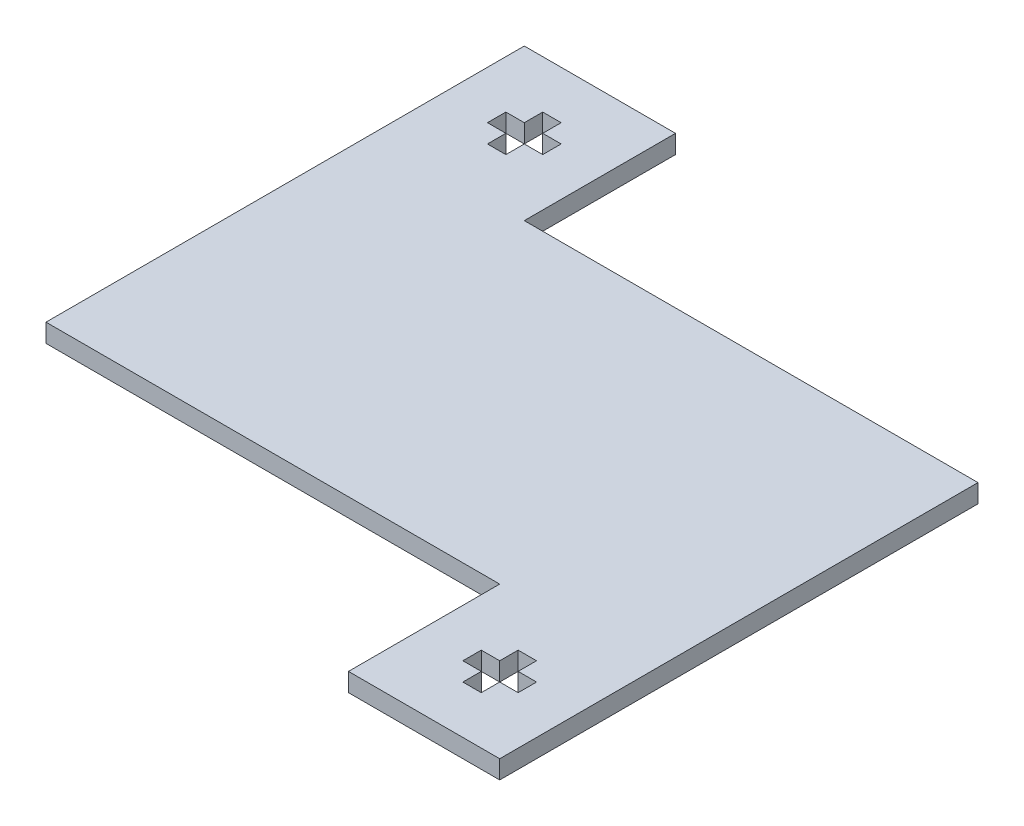
ISO-10303-21;
HEADER;
FILE_DESCRIPTION(('STEP AP214'),'2;1');
FILE_NAME('part.step','',(''),(''),'','','');
FILE_SCHEMA(('AUTOMOTIVE_DESIGN { 1 0 10303 214 1 1 1 1 }'));
ENDSEC;
DATA;
#1=APPLICATION_CONTEXT('core data for automotive mechanical design processes');
#2=APPLICATION_PROTOCOL_DEFINITION('international standard','automotive_design',2000,#1);
#3=PRODUCT_CONTEXT('',#1,'mechanical');
#4=PRODUCT('Part','Part','',(#3));
#5=PRODUCT_RELATED_PRODUCT_CATEGORY('part','',(#4));
#6=PRODUCT_DEFINITION_FORMATION('','',#4);
#7=PRODUCT_DEFINITION_CONTEXT('part definition',#1,'design');
#8=PRODUCT_DEFINITION('design','',#6,#7);
#9=PRODUCT_DEFINITION_SHAPE('','',#8);
#10=(LENGTH_UNIT() NAMED_UNIT(*) SI_UNIT(.MILLI.,.METRE.));
#11=(NAMED_UNIT(*) PLANE_ANGLE_UNIT() SI_UNIT($,.RADIAN.));
#12=(NAMED_UNIT(*) SI_UNIT($,.STERADIAN.) SOLID_ANGLE_UNIT());
#13=UNCERTAINTY_MEASURE_WITH_UNIT(LENGTH_MEASURE(1.E-05),#10,'distance_accuracy_value','');
#14=(GEOMETRIC_REPRESENTATION_CONTEXT(3) GLOBAL_UNCERTAINTY_ASSIGNED_CONTEXT((#13)) GLOBAL_UNIT_ASSIGNED_CONTEXT((#10,
#11,#12)) REPRESENTATION_CONTEXT('',''));
#15=CARTESIAN_POINT('',(0.,0.,0.));
#16=DIRECTION('',(0.,0.,1.));
#17=DIRECTION('',(1.,0.,0.));
#18=AXIS2_PLACEMENT_3D('',#15,#16,#17);
#19=CARTESIAN_POINT('',(0.,5.08,0.));
#20=DIRECTION('',(0.,-1.,0.));
#21=DIRECTION('',(0.,0.,-1.));
#22=AXIS2_PLACEMENT_3D('',#19,#20,#21);
#23=PLANE('',#22);
#24=DIRECTION('',(0.,0.,1.));
#25=VECTOR('',#24,1.);
#26=CARTESIAN_POINT('',(-59.7477773229706,5.08,-56.9383530742659));
#27=LINE('',#26,#25);
#28=CARTESIAN_POINT('',(-59.7477773229706,5.08,-62.0183530742659));
#29=VERTEX_POINT('',#28);
#30=CARTESIAN_POINT('',(-59.7477773229706,5.08,-56.9383530742659));
#31=VERTEX_POINT('',#30);
#32=EDGE_CURVE('E337',#29,#31,#27,.T.);
#33=ORIENTED_EDGE('',*,*,#32,.F.);
#34=DIRECTION('',(-1.,0.,0.));
#35=VECTOR('',#34,1.);
#36=CARTESIAN_POINT('',(-59.7477773229706,5.08,-62.0183530742659));
#37=LINE('',#36,#35);
#38=CARTESIAN_POINT('',(-54.6677773229706,5.08,-62.018353074266));
#39=VERTEX_POINT('',#38);
#40=EDGE_CURVE('E335',#39,#29,#37,.T.);
#41=ORIENTED_EDGE('',*,*,#40,.F.);
#42=DIRECTION('',(0.,0.,-1.));
#43=VECTOR('',#42,1.);
#44=CARTESIAN_POINT('',(-54.6677773229706,5.08,-62.018353074266));
#45=LINE('',#44,#43);
#46=CARTESIAN_POINT('',(-54.6677773229706,5.08,-56.938353074266));
#47=VERTEX_POINT('',#46);
#48=EDGE_CURVE('E358',#47,#39,#45,.T.);
#49=ORIENTED_EDGE('',*,*,#48,.F.);
#50=DIRECTION('',(-1.,0.,0.));
#51=VECTOR('',#50,1.);
#52=CARTESIAN_POINT('',(-54.6677773229706,5.08,-56.938353074266));
#53=LINE('',#52,#51);
#54=CARTESIAN_POINT('',(-49.5877773229706,5.08,-56.938353074266));
#55=VERTEX_POINT('',#54);
#56=EDGE_CURVE('E356',#55,#47,#53,.T.);
#57=ORIENTED_EDGE('',*,*,#56,.F.);
#58=DIRECTION('',(0.,0.,-1.));
#59=VECTOR('',#58,1.);
#60=CARTESIAN_POINT('',(-49.5877773229706,5.08,-54.3983530742659));
#61=LINE('',#60,#59);
#62=CARTESIAN_POINT('',(-49.5877773229706,5.08,-51.8583530742659));
#63=VERTEX_POINT('',#62);
#64=EDGE_CURVE('E354',#63,#55,#61,.T.);
#65=ORIENTED_EDGE('',*,*,#64,.F.);
#66=DIRECTION('',(1.,0.,0.));
#67=VECTOR('',#66,1.);
#68=CARTESIAN_POINT('',(-49.5877773229706,5.08,-51.8583530742659));
#69=LINE('',#68,#67);
#70=CARTESIAN_POINT('',(-54.6677773229706,5.08,-51.8583530742659));
#71=VERTEX_POINT('',#70);
#72=EDGE_CURVE('E352',#71,#63,#69,.T.);
#73=ORIENTED_EDGE('',*,*,#72,.F.);
#74=DIRECTION('',(0.,0.,-1.));
#75=VECTOR('',#74,1.);
#76=CARTESIAN_POINT('',(-54.6677773229706,5.08,-51.8583530742659));
#77=LINE('',#76,#75);
#78=CARTESIAN_POINT('',(-54.6677773229706,5.08,-46.7783530742659));
#79=VERTEX_POINT('',#78);
#80=EDGE_CURVE('E350',#79,#71,#77,.T.);
#81=ORIENTED_EDGE('',*,*,#80,.F.);
#82=DIRECTION('',(1.,0.,0.));
#83=VECTOR('',#82,1.);
#84=CARTESIAN_POINT('',(-57.2077773229706,5.08,-46.778353074266));
#85=LINE('',#84,#83);
#86=CARTESIAN_POINT('',(-59.7477773229706,5.08,-46.7783530742659));
#87=VERTEX_POINT('',#86);
#88=EDGE_CURVE('E348',#87,#79,#85,.T.);
#89=ORIENTED_EDGE('',*,*,#88,.F.);
#90=DIRECTION('',(0.,0.,1.));
#91=VECTOR('',#90,1.);
#92=CARTESIAN_POINT('',(-59.7477773229706,5.08,-46.7783530742659));
#93=LINE('',#92,#91);
#94=CARTESIAN_POINT('',(-59.7477773229706,5.08,-51.8583530742659));
#95=VERTEX_POINT('',#94);
#96=EDGE_CURVE('E346',#95,#87,#93,.T.);
#97=ORIENTED_EDGE('',*,*,#96,.F.);
#98=DIRECTION('',(1.,0.,0.));
#99=VECTOR('',#98,1.);
#100=CARTESIAN_POINT('',(-59.7477773229706,5.08,-51.8583530742659));
#101=LINE('',#100,#99);
#102=CARTESIAN_POINT('',(-64.8277773229706,5.08,-51.8583530742659));
#103=VERTEX_POINT('',#102);
#104=EDGE_CURVE('E344',#103,#95,#101,.T.);
#105=ORIENTED_EDGE('',*,*,#104,.F.);
#106=DIRECTION('',(0.,0.,1.));
#107=VECTOR('',#106,1.);
#108=CARTESIAN_POINT('',(-64.8277773229706,5.08,-54.3983530742659));
#109=LINE('',#108,#107);
#110=CARTESIAN_POINT('',(-64.8277773229706,5.08,-56.938353074266));
#111=VERTEX_POINT('',#110);
#112=EDGE_CURVE('E342',#111,#103,#109,.T.);
#113=ORIENTED_EDGE('',*,*,#112,.F.);
#114=DIRECTION('',(-1.,0.,0.));
#115=VECTOR('',#114,1.);
#116=CARTESIAN_POINT('',(-64.8277773229706,5.08,-56.938353074266));
#117=LINE('',#116,#115);
#118=EDGE_CURVE('E340',#31,#111,#117,.T.);
#119=ORIENTED_EDGE('',*,*,#118,.F.);
#120=EDGE_LOOP('',(#33,#41,#49,#57,#65,#73,#81,#89,#97,#105,#113,#119));
#121=FACE_BOUND('',#120,.T.);
#122=DIRECTION('',(0.,0.,1.));
#123=VECTOR('',#122,1.);
#124=CARTESIAN_POINT('',(-78.0522873229706,5.08,-33.553843074266));
#125=LINE('',#124,#123);
#126=CARTESIAN_POINT('',(-78.0522873229706,5.08,-75.2428630742659));
#127=VERTEX_POINT('',#126);
#128=CARTESIAN_POINT('',(-78.0522873229706,5.08,56.605996925734));
#129=VERTEX_POINT('',#128);
#130=EDGE_CURVE('E423',#127,#129,#125,.T.);
#131=ORIENTED_EDGE('',*,*,#130,.T.);
#132=DIRECTION('',(1.,0.,0.));
#133=VECTOR('',#132,1.);
#134=CARTESIAN_POINT('',(-78.0522873229706,5.08,56.605996925734));
#135=LINE('',#134,#133);
#136=CARTESIAN_POINT('',(47.0147726770294,5.08,56.605996925734));
#137=VERTEX_POINT('',#136);
#138=EDGE_CURVE('E425',#129,#137,#135,.T.);
#139=ORIENTED_EDGE('',*,*,#138,.T.);
#140=DIRECTION('',(0.,0.,1.));
#141=VECTOR('',#140,1.);
#142=CARTESIAN_POINT('',(47.0147726770294,5.08,56.605996925734));
#143=LINE('',#142,#141);
#144=CARTESIAN_POINT('',(47.0147726770294,5.08,98.295016925734));
#145=VERTEX_POINT('',#144);
#146=EDGE_CURVE('E428',#137,#145,#143,.T.);
#147=ORIENTED_EDGE('',*,*,#146,.T.);
#148=DIRECTION('',(1.,0.,0.));
#149=VECTOR('',#148,1.);
#150=CARTESIAN_POINT('',(47.0147726770294,5.08,98.295016925734));
#151=LINE('',#150,#149);
#152=CARTESIAN_POINT('',(88.7088726770294,5.08,98.295016925734));
#153=VERTEX_POINT('',#152);
#154=EDGE_CURVE('E430',#145,#153,#151,.T.);
#155=ORIENTED_EDGE('',*,*,#154,.T.);
#156=DIRECTION('',(0.,0.,-1.));
#157=VECTOR('',#156,1.);
#158=CARTESIAN_POINT('',(88.7088726770294,5.08,56.605996925734));
#159=LINE('',#158,#157);
#160=CARTESIAN_POINT('',(88.7088726770294,5.08,-33.553843074266));
#161=VERTEX_POINT('',#160);
#162=EDGE_CURVE('E432',#153,#161,#159,.T.);
#163=ORIENTED_EDGE('',*,*,#162,.T.);
#164=DIRECTION('',(-1.,0.,0.));
#165=VECTOR('',#164,1.);
#166=CARTESIAN_POINT('',(-36.3632673229706,5.08,-33.5538430742659));
#167=LINE('',#166,#165);
#168=CARTESIAN_POINT('',(-36.3632673229706,5.08,-33.5538430742659));
#169=VERTEX_POINT('',#168);
#170=EDGE_CURVE('E434',#161,#169,#167,.T.);
#171=ORIENTED_EDGE('',*,*,#170,.T.);
#172=DIRECTION('',(0.,0.,-1.));
#173=VECTOR('',#172,1.);
#174=CARTESIAN_POINT('',(-36.3632673229706,5.08,-33.5538430742659));
#175=LINE('',#174,#173);
#176=CARTESIAN_POINT('',(-36.3632673229706,5.08,-75.2428630742659));
#177=VERTEX_POINT('',#176);
#178=EDGE_CURVE('E436',#169,#177,#175,.T.);
#179=ORIENTED_EDGE('',*,*,#178,.T.);
#180=DIRECTION('',(-1.,0.,0.));
#181=VECTOR('',#180,1.);
#182=CARTESIAN_POINT('',(-78.0522873229706,5.08,-75.2428630742659));
#183=LINE('',#182,#181);
#184=EDGE_CURVE('E438',#177,#127,#183,.T.);
#185=ORIENTED_EDGE('',*,*,#184,.T.);
#186=EDGE_LOOP('',(#131,#139,#147,#155,#163,#171,#179,#185));
#187=FACE_BOUND('',#186,.T.);
#188=DIRECTION('',(0.,0.,1.));
#189=VECTOR('',#188,1.);
#190=CARTESIAN_POINT('',(65.3218226770293,5.08,74.910506925734));
#191=LINE('',#190,#189);
#192=CARTESIAN_POINT('',(65.3218226770294,5.08,69.830506925734));
#193=VERTEX_POINT('',#192);
#194=CARTESIAN_POINT('',(65.3218226770293,5.08,74.910506925734));
#195=VERTEX_POINT('',#194);
#196=EDGE_CURVE('E244',#193,#195,#191,.T.);
#197=ORIENTED_EDGE('',*,*,#196,.F.);
#198=DIRECTION('',(-1.,0.,0.));
#199=VECTOR('',#198,1.);
#200=CARTESIAN_POINT('',(65.3218226770294,5.08,69.830506925734));
#201=LINE('',#200,#199);
#202=CARTESIAN_POINT('',(70.4018226770294,5.08,69.830506925734));
#203=VERTEX_POINT('',#202);
#204=EDGE_CURVE('E239',#203,#193,#201,.T.);
#205=ORIENTED_EDGE('',*,*,#204,.F.);
#206=DIRECTION('',(0.,0.,-1.));
#207=VECTOR('',#206,1.);
#208=CARTESIAN_POINT('',(70.4018226770294,5.08,69.830506925734));
#209=LINE('',#208,#207);
#210=CARTESIAN_POINT('',(70.4018226770294,5.08,74.910506925734));
#211=VERTEX_POINT('',#210);
#212=EDGE_CURVE('E278',#211,#203,#209,.T.);
#213=ORIENTED_EDGE('',*,*,#212,.F.);
#214=DIRECTION('',(-1.,0.,0.));
#215=VECTOR('',#214,1.);
#216=CARTESIAN_POINT('',(70.4018226770294,5.08,74.910506925734));
#217=LINE('',#216,#215);
#218=CARTESIAN_POINT('',(75.4818226770294,5.08,74.910506925734));
#219=VERTEX_POINT('',#218);
#220=EDGE_CURVE('E276',#219,#211,#217,.T.);
#221=ORIENTED_EDGE('',*,*,#220,.F.);
#222=DIRECTION('',(0.,0.,-1.));
#223=VECTOR('',#222,1.);
#224=CARTESIAN_POINT('',(75.4818226770294,5.08,77.450506925734));
#225=LINE('',#224,#223);
#226=CARTESIAN_POINT('',(75.4818226770294,5.08,79.990506925734));
#227=VERTEX_POINT('',#226);
#228=EDGE_CURVE('E274',#227,#219,#225,.T.);
#229=ORIENTED_EDGE('',*,*,#228,.F.);
#230=DIRECTION('',(1.,0.,0.));
#231=VECTOR('',#230,1.);
#232=CARTESIAN_POINT('',(75.4818226770294,5.08,79.990506925734));
#233=LINE('',#232,#231);
#234=CARTESIAN_POINT('',(70.4018226770294,5.08,79.990506925734));
#235=VERTEX_POINT('',#234);
#236=EDGE_CURVE('E272',#235,#227,#233,.T.);
#237=ORIENTED_EDGE('',*,*,#236,.F.);
#238=DIRECTION('',(0.,0.,-1.));
#239=VECTOR('',#238,1.);
#240=CARTESIAN_POINT('',(70.4018226770294,5.08,79.990506925734));
#241=LINE('',#240,#239);
#242=CARTESIAN_POINT('',(70.4018226770294,5.08,85.070506925734));
#243=VERTEX_POINT('',#242);
#244=EDGE_CURVE('E270',#243,#235,#241,.T.);
#245=ORIENTED_EDGE('',*,*,#244,.F.);
#246=DIRECTION('',(1.,0.,0.));
#247=VECTOR('',#246,1.);
#248=CARTESIAN_POINT('',(67.8618226770294,5.08,85.070506925734));
#249=LINE('',#248,#247);
#250=CARTESIAN_POINT('',(65.3218226770294,5.08,85.0705069257341));
#251=VERTEX_POINT('',#250);
#252=EDGE_CURVE('E268',#251,#243,#249,.T.);
#253=ORIENTED_EDGE('',*,*,#252,.F.);
#254=DIRECTION('',(0.,0.,1.));
#255=VECTOR('',#254,1.);
#256=CARTESIAN_POINT('',(65.3218226770294,5.08,85.0705069257341));
#257=LINE('',#256,#255);
#258=CARTESIAN_POINT('',(65.3218226770294,5.08,79.9905069257341));
#259=VERTEX_POINT('',#258);
#260=EDGE_CURVE('E266',#259,#251,#257,.T.);
#261=ORIENTED_EDGE('',*,*,#260,.F.);
#262=DIRECTION('',(1.,0.,0.));
#263=VECTOR('',#262,1.);
#264=CARTESIAN_POINT('',(65.3218226770294,5.08,79.9905069257341));
#265=LINE('',#264,#263);
#266=CARTESIAN_POINT('',(60.2418226770294,5.08,79.990506925734));
#267=VERTEX_POINT('',#266);
#268=EDGE_CURVE('E264',#267,#259,#265,.T.);
#269=ORIENTED_EDGE('',*,*,#268,.F.);
#270=DIRECTION('',(0.,0.,1.));
#271=VECTOR('',#270,1.);
#272=CARTESIAN_POINT('',(60.2418226770294,5.08,77.450506925734));
#273=LINE('',#272,#271);
#274=CARTESIAN_POINT('',(60.2418226770294,5.08,74.910506925734));
#275=VERTEX_POINT('',#274);
#276=EDGE_CURVE('E260',#275,#267,#273,.T.);
#277=ORIENTED_EDGE('',*,*,#276,.F.);
#278=DIRECTION('',(-1.,0.,0.));
#279=VECTOR('',#278,1.);
#280=CARTESIAN_POINT('',(60.2418226770294,5.08,74.910506925734));
#281=LINE('',#280,#279);
#282=EDGE_CURVE('E258',#195,#275,#281,.T.);
#283=ORIENTED_EDGE('',*,*,#282,.F.);
#284=EDGE_LOOP('',(#197,#205,#213,#221,#229,#237,#245,#253,#261,#269,#277,#283));
#285=FACE_BOUND('',#284,.T.);
#286=ADVANCED_FACE('F33',(#121,#187,#285),#23,.F.);
#287=CARTESIAN_POINT('',(0.,0.,0.));
#288=DIRECTION('',(0.,-1.,0.));
#289=DIRECTION('',(0.,0.,-1.));
#290=AXIS2_PLACEMENT_3D('',#287,#288,#289);
#291=PLANE('',#290);
#292=DIRECTION('',(0.,0.,1.));
#293=VECTOR('',#292,1.);
#294=CARTESIAN_POINT('',(-78.0522873229706,0.,-33.553843074266));
#295=LINE('',#294,#293);
#296=CARTESIAN_POINT('',(-78.0522873229706,0.,-75.2428630742659));
#297=VERTEX_POINT('',#296);
#298=CARTESIAN_POINT('',(-78.0522873229706,0.,56.605996925734));
#299=VERTEX_POINT('',#298);
#300=EDGE_CURVE('E422',#297,#299,#295,.T.);
#301=ORIENTED_EDGE('',*,*,#300,.F.);
#302=DIRECTION('',(-1.,0.,0.));
#303=VECTOR('',#302,1.);
#304=CARTESIAN_POINT('',(-78.0522873229706,0.,-75.2428630742659));
#305=LINE('',#304,#303);
#306=CARTESIAN_POINT('',(-36.3632673229706,0.,-75.2428630742659));
#307=VERTEX_POINT('',#306);
#308=EDGE_CURVE('E426',#307,#297,#305,.T.);
#309=ORIENTED_EDGE('',*,*,#308,.F.);
#310=DIRECTION('',(0.,0.,-1.));
#311=VECTOR('',#310,1.);
#312=CARTESIAN_POINT('',(-36.3632673229706,0.,-33.5538430742659));
#313=LINE('',#312,#311);
#314=CARTESIAN_POINT('',(-36.3632673229706,0.,-33.5538430742659));
#315=VERTEX_POINT('',#314);
#316=EDGE_CURVE('E453',#315,#307,#313,.T.);
#317=ORIENTED_EDGE('',*,*,#316,.F.);
#318=DIRECTION('',(-1.,0.,0.));
#319=VECTOR('',#318,1.);
#320=CARTESIAN_POINT('',(-36.3632673229706,0.,-33.5538430742659));
#321=LINE('',#320,#319);
#322=CARTESIAN_POINT('',(88.7088726770294,0.,-33.553843074266));
#323=VERTEX_POINT('',#322);
#324=EDGE_CURVE('E451',#323,#315,#321,.T.);
#325=ORIENTED_EDGE('',*,*,#324,.F.);
#326=DIRECTION('',(0.,0.,-1.));
#327=VECTOR('',#326,1.);
#328=CARTESIAN_POINT('',(88.7088726770294,0.,-33.553843074266));
#329=LINE('',#328,#327);
#330=CARTESIAN_POINT('',(88.7088726770294,0.,98.295016925734));
#331=VERTEX_POINT('',#330);
#332=EDGE_CURVE('E449',#331,#323,#329,.T.);
#333=ORIENTED_EDGE('',*,*,#332,.F.);
#334=DIRECTION('',(1.,0.,0.));
#335=VECTOR('',#334,1.);
#336=CARTESIAN_POINT('',(47.0147726770294,0.,98.295016925734));
#337=LINE('',#336,#335);
#338=CARTESIAN_POINT('',(47.0147726770294,0.,98.295016925734));
#339=VERTEX_POINT('',#338);
#340=EDGE_CURVE('E446',#339,#331,#337,.T.);
#341=ORIENTED_EDGE('',*,*,#340,.F.);
#342=DIRECTION('',(0.,0.,1.));
#343=VECTOR('',#342,1.);
#344=CARTESIAN_POINT('',(47.0147726770294,0.,56.605996925734));
#345=LINE('',#344,#343);
#346=CARTESIAN_POINT('',(47.0147726770294,0.,56.605996925734));
#347=VERTEX_POINT('',#346);
#348=EDGE_CURVE('E444',#347,#339,#345,.T.);
#349=ORIENTED_EDGE('',*,*,#348,.F.);
#350=DIRECTION('',(1.,0.,0.));
#351=VECTOR('',#350,1.);
#352=CARTESIAN_POINT('',(-78.0522873229706,0.,56.605996925734));
#353=LINE('',#352,#351);
#354=EDGE_CURVE('E442',#299,#347,#353,.T.);
#355=ORIENTED_EDGE('',*,*,#354,.F.);
#356=EDGE_LOOP('',(#301,#309,#317,#325,#333,#341,#349,#355));
#357=FACE_BOUND('',#356,.T.);
#358=DIRECTION('',(-1.,0.,0.));
#359=VECTOR('',#358,1.);
#360=CARTESIAN_POINT('',(-57.2077773229706,0.,-62.018353074266));
#361=LINE('',#360,#359);
#362=CARTESIAN_POINT('',(-54.6677773229706,0.,-62.018353074266));
#363=VERTEX_POINT('',#362);
#364=CARTESIAN_POINT('',(-59.7477773229706,0.,-62.018353074266));
#365=VERTEX_POINT('',#364);
#366=EDGE_CURVE('E338',#363,#365,#361,.T.);
#367=ORIENTED_EDGE('',*,*,#366,.T.);
#368=DIRECTION('',(0.,0.,1.));
#369=VECTOR('',#368,1.);
#370=CARTESIAN_POINT('',(-59.7477773229706,0.,-56.9383530742659));
#371=LINE('',#370,#369);
#372=CARTESIAN_POINT('',(-59.7477773229706,0.,-56.9383530742659));
#373=VERTEX_POINT('',#372);
#374=EDGE_CURVE('E253',#365,#373,#371,.T.);
#375=ORIENTED_EDGE('',*,*,#374,.T.);
#376=DIRECTION('',(-1.,0.,0.));
#377=VECTOR('',#376,1.);
#378=CARTESIAN_POINT('',(-64.8277773229706,0.,-56.938353074266));
#379=LINE('',#378,#377);
#380=CARTESIAN_POINT('',(-64.8277773229706,0.,-56.938353074266));
#381=VERTEX_POINT('',#380);
#382=EDGE_CURVE('E364',#373,#381,#379,.T.);
#383=ORIENTED_EDGE('',*,*,#382,.T.);
#384=DIRECTION('',(0.,0.,1.));
#385=VECTOR('',#384,1.);
#386=CARTESIAN_POINT('',(-64.8277773229706,0.,-51.8583530742659));
#387=LINE('',#386,#385);
#388=CARTESIAN_POINT('',(-64.8277773229706,0.,-51.8583530742659));
#389=VERTEX_POINT('',#388);
#390=EDGE_CURVE('E367',#381,#389,#387,.T.);
#391=ORIENTED_EDGE('',*,*,#390,.T.);
#392=DIRECTION('',(1.,0.,0.));
#393=VECTOR('',#392,1.);
#394=CARTESIAN_POINT('',(-59.7477773229706,0.,-51.8583530742659));
#395=LINE('',#394,#393);
#396=CARTESIAN_POINT('',(-59.7477773229706,0.,-51.8583530742659));
#397=VERTEX_POINT('',#396);
#398=EDGE_CURVE('E370',#389,#397,#395,.T.);
#399=ORIENTED_EDGE('',*,*,#398,.T.);
#400=DIRECTION('',(0.,0.,1.));
#401=VECTOR('',#400,1.);
#402=CARTESIAN_POINT('',(-59.7477773229706,0.,-46.7783530742659));
#403=LINE('',#402,#401);
#404=CARTESIAN_POINT('',(-59.7477773229706,0.,-46.7783530742659));
#405=VERTEX_POINT('',#404);
#406=EDGE_CURVE('E373',#397,#405,#403,.T.);
#407=ORIENTED_EDGE('',*,*,#406,.T.);
#408=DIRECTION('',(1.,0.,0.));
#409=VECTOR('',#408,1.);
#410=CARTESIAN_POINT('',(-54.6677773229706,0.,-46.7783530742659));
#411=LINE('',#410,#409);
#412=CARTESIAN_POINT('',(-54.6677773229706,0.,-46.7783530742659));
#413=VERTEX_POINT('',#412);
#414=EDGE_CURVE('E376',#405,#413,#411,.T.);
#415=ORIENTED_EDGE('',*,*,#414,.T.);
#416=DIRECTION('',(0.,0.,-1.));
#417=VECTOR('',#416,1.);
#418=CARTESIAN_POINT('',(-54.6677773229706,0.,-51.8583530742659));
#419=LINE('',#418,#417);
#420=CARTESIAN_POINT('',(-54.6677773229706,0.,-51.8583530742659));
#421=VERTEX_POINT('',#420);
#422=EDGE_CURVE('E379',#413,#421,#419,.T.);
#423=ORIENTED_EDGE('',*,*,#422,.T.);
#424=DIRECTION('',(1.,0.,0.));
#425=VECTOR('',#424,1.);
#426=CARTESIAN_POINT('',(-49.5877773229706,0.,-51.8583530742659));
#427=LINE('',#426,#425);
#428=CARTESIAN_POINT('',(-49.5877773229706,0.,-51.8583530742659));
#429=VERTEX_POINT('',#428);
#430=EDGE_CURVE('E382',#421,#429,#427,.T.);
#431=ORIENTED_EDGE('',*,*,#430,.T.);
#432=DIRECTION('',(0.,0.,-1.));
#433=VECTOR('',#432,1.);
#434=CARTESIAN_POINT('',(-49.5877773229706,0.,-56.938353074266));
#435=LINE('',#434,#433);
#436=CARTESIAN_POINT('',(-49.5877773229706,0.,-56.938353074266));
#437=VERTEX_POINT('',#436);
#438=EDGE_CURVE('E385',#429,#437,#435,.T.);
#439=ORIENTED_EDGE('',*,*,#438,.T.);
#440=DIRECTION('',(-1.,0.,0.));
#441=VECTOR('',#440,1.);
#442=CARTESIAN_POINT('',(-54.6677773229706,0.,-56.938353074266));
#443=LINE('',#442,#441);
#444=CARTESIAN_POINT('',(-54.6677773229706,0.,-56.938353074266));
#445=VERTEX_POINT('',#444);
#446=EDGE_CURVE('E388',#437,#445,#443,.T.);
#447=ORIENTED_EDGE('',*,*,#446,.T.);
#448=DIRECTION('',(0.,0.,-1.));
#449=VECTOR('',#448,1.);
#450=CARTESIAN_POINT('',(-54.6677773229706,0.,-62.018353074266));
#451=LINE('',#450,#449);
#452=EDGE_CURVE('E391',#445,#363,#451,.T.);
#453=ORIENTED_EDGE('',*,*,#452,.T.);
#454=EDGE_LOOP('',(#367,#375,#383,#391,#399,#407,#415,#423,#431,#439,#447,#453));
#455=FACE_BOUND('',#454,.T.);
#456=DIRECTION('',(-1.,0.,0.));
#457=VECTOR('',#456,1.);
#458=CARTESIAN_POINT('',(67.8618226770294,0.,69.830506925734));
#459=LINE('',#458,#457);
#460=CARTESIAN_POINT('',(70.4018226770294,0.,69.830506925734));
#461=VERTEX_POINT('',#460);
#462=CARTESIAN_POINT('',(65.3218226770294,0.,69.830506925734));
#463=VERTEX_POINT('',#462);
#464=EDGE_CURVE('E245',#461,#463,#459,.T.);
#465=ORIENTED_EDGE('',*,*,#464,.T.);
#466=DIRECTION('',(0.,0.,1.));
#467=VECTOR('',#466,1.);
#468=CARTESIAN_POINT('',(65.3218226770293,0.,74.910506925734));
#469=LINE('',#468,#467);
#470=CARTESIAN_POINT('',(65.3218226770293,0.,74.910506925734));
#471=VERTEX_POINT('',#470);
#472=EDGE_CURVE('E251',#463,#471,#469,.T.);
#473=ORIENTED_EDGE('',*,*,#472,.T.);
#474=DIRECTION('',(-1.,0.,0.));
#475=VECTOR('',#474,1.);
#476=CARTESIAN_POINT('',(60.2418226770294,0.,74.910506925734));
#477=LINE('',#476,#475);
#478=CARTESIAN_POINT('',(60.2418226770294,0.,74.910506925734));
#479=VERTEX_POINT('',#478);
#480=EDGE_CURVE('E281',#471,#479,#477,.T.);
#481=ORIENTED_EDGE('',*,*,#480,.T.);
#482=DIRECTION('',(0.,0.,1.));
#483=VECTOR('',#482,1.);
#484=CARTESIAN_POINT('',(60.2418226770294,0.,79.990506925734));
#485=LINE('',#484,#483);
#486=CARTESIAN_POINT('',(60.2418226770294,0.,79.990506925734));
#487=VERTEX_POINT('',#486);
#488=EDGE_CURVE('E284',#479,#487,#485,.T.);
#489=ORIENTED_EDGE('',*,*,#488,.T.);
#490=DIRECTION('',(1.,0.,0.));
#491=VECTOR('',#490,1.);
#492=CARTESIAN_POINT('',(65.3218226770294,0.,79.9905069257341));
#493=LINE('',#492,#491);
#494=CARTESIAN_POINT('',(65.3218226770294,0.,79.9905069257341));
#495=VERTEX_POINT('',#494);
#496=EDGE_CURVE('E287',#487,#495,#493,.T.);
#497=ORIENTED_EDGE('',*,*,#496,.T.);
#498=DIRECTION('',(0.,0.,1.));
#499=VECTOR('',#498,1.);
#500=CARTESIAN_POINT('',(65.3218226770294,0.,85.0705069257341));
#501=LINE('',#500,#499);
#502=CARTESIAN_POINT('',(65.3218226770294,0.,85.0705069257341));
#503=VERTEX_POINT('',#502);
#504=EDGE_CURVE('E290',#495,#503,#501,.T.);
#505=ORIENTED_EDGE('',*,*,#504,.T.);
#506=DIRECTION('',(1.,0.,0.));
#507=VECTOR('',#506,1.);
#508=CARTESIAN_POINT('',(70.4018226770294,0.,85.070506925734));
#509=LINE('',#508,#507);
#510=CARTESIAN_POINT('',(70.4018226770294,0.,85.070506925734));
#511=VERTEX_POINT('',#510);
#512=EDGE_CURVE('E293',#503,#511,#509,.T.);
#513=ORIENTED_EDGE('',*,*,#512,.T.);
#514=DIRECTION('',(0.,0.,-1.));
#515=VECTOR('',#514,1.);
#516=CARTESIAN_POINT('',(70.4018226770294,0.,79.990506925734));
#517=LINE('',#516,#515);
#518=CARTESIAN_POINT('',(70.4018226770294,0.,79.990506925734));
#519=VERTEX_POINT('',#518);
#520=EDGE_CURVE('E296',#511,#519,#517,.T.);
#521=ORIENTED_EDGE('',*,*,#520,.T.);
#522=DIRECTION('',(1.,0.,0.));
#523=VECTOR('',#522,1.);
#524=CARTESIAN_POINT('',(75.4818226770294,0.,79.990506925734));
#525=LINE('',#524,#523);
#526=CARTESIAN_POINT('',(75.4818226770294,0.,79.990506925734));
#527=VERTEX_POINT('',#526);
#528=EDGE_CURVE('E299',#519,#527,#525,.T.);
#529=ORIENTED_EDGE('',*,*,#528,.T.);
#530=DIRECTION('',(0.,0.,-1.));
#531=VECTOR('',#530,1.);
#532=CARTESIAN_POINT('',(75.4818226770294,0.,74.910506925734));
#533=LINE('',#532,#531);
#534=CARTESIAN_POINT('',(75.4818226770294,0.,74.910506925734));
#535=VERTEX_POINT('',#534);
#536=EDGE_CURVE('E302',#527,#535,#533,.T.);
#537=ORIENTED_EDGE('',*,*,#536,.T.);
#538=DIRECTION('',(-1.,0.,0.));
#539=VECTOR('',#538,1.);
#540=CARTESIAN_POINT('',(70.4018226770294,0.,74.910506925734));
#541=LINE('',#540,#539);
#542=CARTESIAN_POINT('',(70.4018226770294,0.,74.910506925734));
#543=VERTEX_POINT('',#542);
#544=EDGE_CURVE('E305',#535,#543,#541,.T.);
#545=ORIENTED_EDGE('',*,*,#544,.T.);
#546=DIRECTION('',(0.,0.,-1.));
#547=VECTOR('',#546,1.);
#548=CARTESIAN_POINT('',(70.4018226770294,0.,69.830506925734));
#549=LINE('',#548,#547);
#550=EDGE_CURVE('E308',#543,#461,#549,.T.);
#551=ORIENTED_EDGE('',*,*,#550,.T.);
#552=EDGE_LOOP('',(#465,#473,#481,#489,#497,#505,#513,#521,#529,#537,#545,#551));
#553=FACE_BOUND('',#552,.T.);
#554=ADVANCED_FACE('F485',(#357,#455,#553),#291,.T.);
#555=CARTESIAN_POINT('',(-78.0522873229706,5.08,-33.553843074266));
#556=DIRECTION('',(1.,0.,0.));
#557=DIRECTION('',(0.,0.,-1.));
#558=AXIS2_PLACEMENT_3D('',#555,#556,#557);
#559=PLANE('',#558);
#560=ORIENTED_EDGE('',*,*,#300,.T.);
#561=DIRECTION('',(0.,-1.,0.));
#562=VECTOR('',#561,1.);
#563=CARTESIAN_POINT('',(-78.0522873229706,5.08,56.605996925734));
#564=LINE('',#563,#562);
#565=EDGE_CURVE('E11',#129,#299,#564,.T.);
#566=ORIENTED_EDGE('',*,*,#565,.F.);
#567=ORIENTED_EDGE('',*,*,#130,.F.);
#568=DIRECTION('',(0.,-1.,0.));
#569=VECTOR('',#568,1.);
#570=CARTESIAN_POINT('',(-78.0522873229706,5.08,-75.2428630742659));
#571=LINE('',#570,#569);
#572=EDGE_CURVE('E440',#127,#297,#571,.T.);
#573=ORIENTED_EDGE('',*,*,#572,.T.);
#574=EDGE_LOOP('',(#560,#566,#567,#573));
#575=FACE_BOUND('',#574,.T.);
#576=ADVANCED_FACE('F35',(#575),#559,.F.);
#577=CARTESIAN_POINT('',(-78.0522873229706,5.08,56.605996925734));
#578=DIRECTION('',(0.,0.,-1.));
#579=DIRECTION('',(-1.,0.,0.));
#580=AXIS2_PLACEMENT_3D('',#577,#578,#579);
#581=PLANE('',#580);
#582=ORIENTED_EDGE('',*,*,#354,.T.);
#583=DIRECTION('',(0.,-1.,0.));
#584=VECTOR('',#583,1.);
#585=CARTESIAN_POINT('',(47.0147726770294,5.08,56.605996925734));
#586=LINE('',#585,#584);
#587=EDGE_CURVE('E41',#137,#347,#586,.T.);
#588=ORIENTED_EDGE('',*,*,#587,.F.);
#589=ORIENTED_EDGE('',*,*,#138,.F.);
#590=ORIENTED_EDGE('',*,*,#565,.T.);
#591=EDGE_LOOP('',(#582,#588,#589,#590));
#592=FACE_BOUND('',#591,.T.);
#593=ADVANCED_FACE('F501',(#592),#581,.F.);
#594=CARTESIAN_POINT('',(47.0147726770294,5.08,56.605996925734));
#595=DIRECTION('',(1.,0.,0.));
#596=DIRECTION('',(0.,0.,-1.));
#597=AXIS2_PLACEMENT_3D('',#594,#595,#596);
#598=PLANE('',#597);
#599=ORIENTED_EDGE('',*,*,#348,.T.);
#600=DIRECTION('',(0.,-1.,0.));
#601=VECTOR('',#600,1.);
#602=CARTESIAN_POINT('',(47.0147726770294,5.08,98.295016925734));
#603=LINE('',#602,#601);
#604=EDGE_CURVE('E471',#145,#339,#603,.T.);
#605=ORIENTED_EDGE('',*,*,#604,.F.);
#606=ORIENTED_EDGE('',*,*,#146,.F.);
#607=ORIENTED_EDGE('',*,*,#587,.T.);
#608=EDGE_LOOP('',(#599,#605,#606,#607));
#609=FACE_BOUND('',#608,.T.);
#610=ADVANCED_FACE('F478',(#609),#598,.F.);
#611=CARTESIAN_POINT('',(47.0147726770294,5.08,98.295016925734));
#612=DIRECTION('',(0.,0.,-1.));
#613=DIRECTION('',(-1.,0.,0.));
#614=AXIS2_PLACEMENT_3D('',#611,#612,#613);
#615=PLANE('',#614);
#616=ORIENTED_EDGE('',*,*,#340,.T.);
#617=DIRECTION('',(0.,-1.,0.));
#618=VECTOR('',#617,1.);
#619=CARTESIAN_POINT('',(88.7088726770294,5.08,98.295016925734));
#620=LINE('',#619,#618);
#621=EDGE_CURVE('E468',#153,#331,#620,.T.);
#622=ORIENTED_EDGE('',*,*,#621,.F.);
#623=ORIENTED_EDGE('',*,*,#154,.F.);
#624=ORIENTED_EDGE('',*,*,#604,.T.);
#625=EDGE_LOOP('',(#616,#622,#623,#624));
#626=FACE_BOUND('',#625,.T.);
#627=ADVANCED_FACE('F490',(#626),#615,.F.);
#628=CARTESIAN_POINT('',(88.7088726770294,5.08,-33.553843074266));
#629=DIRECTION('',(-1.,0.,0.));
#630=DIRECTION('',(0.,0.,1.));
#631=AXIS2_PLACEMENT_3D('',#628,#629,#630);
#632=PLANE('',#631);
#633=ORIENTED_EDGE('',*,*,#332,.T.);
#634=DIRECTION('',(0.,-1.,0.));
#635=VECTOR('',#634,1.);
#636=CARTESIAN_POINT('',(88.7088726770294,5.08,-33.553843074266));
#637=LINE('',#636,#635);
#638=EDGE_CURVE('E465',#161,#323,#637,.T.);
#639=ORIENTED_EDGE('',*,*,#638,.F.);
#640=ORIENTED_EDGE('',*,*,#162,.F.);
#641=ORIENTED_EDGE('',*,*,#621,.T.);
#642=EDGE_LOOP('',(#633,#639,#640,#641));
#643=FACE_BOUND('',#642,.T.);
#644=ADVANCED_FACE('F494',(#643),#632,.F.);
#645=CARTESIAN_POINT('',(-36.3632673229706,5.08,-33.5538430742659));
#646=DIRECTION('',(0.,0.,1.));
#647=DIRECTION('',(1.,0.,0.));
#648=AXIS2_PLACEMENT_3D('',#645,#646,#647);
#649=PLANE('',#648);
#650=ORIENTED_EDGE('',*,*,#324,.T.);
#651=DIRECTION('',(0.,-1.,0.));
#652=VECTOR('',#651,1.);
#653=CARTESIAN_POINT('',(-36.3632673229706,5.08,-33.5538430742659));
#654=LINE('',#653,#652);
#655=EDGE_CURVE('E462',#169,#315,#654,.T.);
#656=ORIENTED_EDGE('',*,*,#655,.F.);
#657=ORIENTED_EDGE('',*,*,#170,.F.);
#658=ORIENTED_EDGE('',*,*,#638,.T.);
#659=EDGE_LOOP('',(#650,#656,#657,#658));
#660=FACE_BOUND('',#659,.T.);
#661=ADVANCED_FACE('F514',(#660),#649,.F.);
#662=CARTESIAN_POINT('',(-36.3632673229706,5.08,-33.5538430742659));
#663=DIRECTION('',(-1.,0.,0.));
#664=DIRECTION('',(0.,0.,1.));
#665=AXIS2_PLACEMENT_3D('',#662,#663,#664);
#666=PLANE('',#665);
#667=ORIENTED_EDGE('',*,*,#316,.T.);
#668=DIRECTION('',(0.,-1.,0.));
#669=VECTOR('',#668,1.);
#670=CARTESIAN_POINT('',(-36.3632673229706,5.08,-75.2428630742659));
#671=LINE('',#670,#669);
#672=EDGE_CURVE('E459',#177,#307,#671,.T.);
#673=ORIENTED_EDGE('',*,*,#672,.F.);
#674=ORIENTED_EDGE('',*,*,#178,.F.);
#675=ORIENTED_EDGE('',*,*,#655,.T.);
#676=EDGE_LOOP('',(#667,#673,#674,#675));
#677=FACE_BOUND('',#676,.T.);
#678=ADVANCED_FACE('F512',(#677),#666,.F.);
#679=CARTESIAN_POINT('',(-78.0522873229706,5.08,-75.2428630742659));
#680=DIRECTION('',(0.,0.,1.));
#681=DIRECTION('',(1.,0.,0.));
#682=AXIS2_PLACEMENT_3D('',#679,#680,#681);
#683=PLANE('',#682);
#684=ORIENTED_EDGE('',*,*,#308,.T.);
#685=ORIENTED_EDGE('',*,*,#572,.F.);
#686=ORIENTED_EDGE('',*,*,#184,.F.);
#687=ORIENTED_EDGE('',*,*,#672,.T.);
#688=EDGE_LOOP('',(#684,#685,#686,#687));
#689=FACE_BOUND('',#688,.T.);
#690=ADVANCED_FACE('F507',(#689),#683,.F.);
#691=CARTESIAN_POINT('',(-59.7477773229706,5.08,-56.9383530742659));
#692=DIRECTION('',(1.,0.,0.));
#693=DIRECTION('',(0.,0.,-1.));
#694=AXIS2_PLACEMENT_3D('',#691,#692,#693);
#695=PLANE('',#694);
#696=ORIENTED_EDGE('',*,*,#374,.F.);
#697=DIRECTION('',(0.,-1.,0.));
#698=VECTOR('',#697,1.);
#699=CARTESIAN_POINT('',(-59.7477773229706,5.08,-62.0183530742659));
#700=LINE('',#699,#698);
#701=EDGE_CURVE('E420',#29,#365,#700,.T.);
#702=ORIENTED_EDGE('',*,*,#701,.F.);
#703=ORIENTED_EDGE('',*,*,#32,.T.);
#704=DIRECTION('',(0.,-1.,0.));
#705=VECTOR('',#704,1.);
#706=CARTESIAN_POINT('',(-59.7477773229706,5.08,-56.9383530742659));
#707=LINE('',#706,#705);
#708=EDGE_CURVE('E418',#31,#373,#707,.T.);
#709=ORIENTED_EDGE('',*,*,#708,.T.);
#710=EDGE_LOOP('',(#696,#702,#703,#709));
#711=FACE_BOUND('',#710,.T.);
#712=ADVANCED_FACE('F532',(#711),#695,.T.);
#713=CARTESIAN_POINT('',(-64.8277773229706,5.08,-56.938353074266));
#714=DIRECTION('',(0.,0.,1.));
#715=DIRECTION('',(1.,0.,0.));
#716=AXIS2_PLACEMENT_3D('',#713,#714,#715);
#717=PLANE('',#716);
#718=ORIENTED_EDGE('',*,*,#382,.F.);
#719=ORIENTED_EDGE('',*,*,#708,.F.);
#720=ORIENTED_EDGE('',*,*,#118,.T.);
#721=DIRECTION('',(0.,-1.,0.));
#722=VECTOR('',#721,1.);
#723=CARTESIAN_POINT('',(-64.8277773229706,5.08,-56.938353074266));
#724=LINE('',#723,#722);
#725=EDGE_CURVE('E415',#111,#381,#724,.T.);
#726=ORIENTED_EDGE('',*,*,#725,.T.);
#727=EDGE_LOOP('',(#718,#719,#720,#726));
#728=FACE_BOUND('',#727,.T.);
#729=ADVANCED_FACE('F539',(#728),#717,.T.);
#730=CARTESIAN_POINT('',(-64.8277773229706,5.08,-51.8583530742659));
#731=DIRECTION('',(1.,0.,0.));
#732=DIRECTION('',(0.,0.,-1.));
#733=AXIS2_PLACEMENT_3D('',#730,#731,#732);
#734=PLANE('',#733);
#735=ORIENTED_EDGE('',*,*,#390,.F.);
#736=ORIENTED_EDGE('',*,*,#725,.F.);
#737=ORIENTED_EDGE('',*,*,#112,.T.);
#738=DIRECTION('',(0.,-1.,0.));
#739=VECTOR('',#738,1.);
#740=CARTESIAN_POINT('',(-64.8277773229706,5.08,-51.8583530742659));
#741=LINE('',#740,#739);
#742=EDGE_CURVE('E413',#103,#389,#741,.T.);
#743=ORIENTED_EDGE('',*,*,#742,.T.);
#744=EDGE_LOOP('',(#735,#736,#737,#743));
#745=FACE_BOUND('',#744,.T.);
#746=ADVANCED_FACE('F544',(#745),#734,.T.);
#747=CARTESIAN_POINT('',(-59.7477773229706,5.08,-51.8583530742659));
#748=DIRECTION('',(0.,0.,-1.));
#749=DIRECTION('',(-1.,0.,0.));
#750=AXIS2_PLACEMENT_3D('',#747,#748,#749);
#751=PLANE('',#750);
#752=ORIENTED_EDGE('',*,*,#398,.F.);
#753=ORIENTED_EDGE('',*,*,#742,.F.);
#754=ORIENTED_EDGE('',*,*,#104,.T.);
#755=DIRECTION('',(0.,-1.,0.));
#756=VECTOR('',#755,1.);
#757=CARTESIAN_POINT('',(-59.7477773229706,5.08,-51.8583530742659));
#758=LINE('',#757,#756);
#759=EDGE_CURVE('E411',#95,#397,#758,.T.);
#760=ORIENTED_EDGE('',*,*,#759,.T.);
#761=EDGE_LOOP('',(#752,#753,#754,#760));
#762=FACE_BOUND('',#761,.T.);
#763=ADVANCED_FACE('F566',(#762),#751,.T.);
#764=CARTESIAN_POINT('',(-59.7477773229706,5.08,-46.7783530742659));
#765=DIRECTION('',(1.,0.,0.));
#766=DIRECTION('',(0.,0.,-1.));
#767=AXIS2_PLACEMENT_3D('',#764,#765,#766);
#768=PLANE('',#767);
#769=ORIENTED_EDGE('',*,*,#406,.F.);
#770=ORIENTED_EDGE('',*,*,#759,.F.);
#771=ORIENTED_EDGE('',*,*,#96,.T.);
#772=DIRECTION('',(0.,-1.,0.));
#773=VECTOR('',#772,1.);
#774=CARTESIAN_POINT('',(-59.7477773229706,5.08,-46.7783530742659));
#775=LINE('',#774,#773);
#776=EDGE_CURVE('E408',#87,#405,#775,.T.);
#777=ORIENTED_EDGE('',*,*,#776,.T.);
#778=EDGE_LOOP('',(#769,#770,#771,#777));
#779=FACE_BOUND('',#778,.T.);
#780=ADVANCED_FACE('F571',(#779),#768,.T.);
#781=CARTESIAN_POINT('',(-54.6677773229706,5.08,-46.7783530742659));
#782=DIRECTION('',(0.,0.,-1.));
#783=DIRECTION('',(-1.,0.,0.));
#784=AXIS2_PLACEMENT_3D('',#781,#782,#783);
#785=PLANE('',#784);
#786=ORIENTED_EDGE('',*,*,#414,.F.);
#787=ORIENTED_EDGE('',*,*,#776,.F.);
#788=ORIENTED_EDGE('',*,*,#88,.T.);
#789=DIRECTION('',(0.,-1.,0.));
#790=VECTOR('',#789,1.);
#791=CARTESIAN_POINT('',(-54.6677773229706,5.08,-46.7783530742659));
#792=LINE('',#791,#790);
#793=EDGE_CURVE('E406',#79,#413,#792,.T.);
#794=ORIENTED_EDGE('',*,*,#793,.T.);
#795=EDGE_LOOP('',(#786,#787,#788,#794));
#796=FACE_BOUND('',#795,.T.);
#797=ADVANCED_FACE('F575',(#796),#785,.T.);
#798=CARTESIAN_POINT('',(-54.6677773229706,5.08,-51.8583530742659));
#799=DIRECTION('',(-1.,0.,0.));
#800=DIRECTION('',(0.,0.,1.));
#801=AXIS2_PLACEMENT_3D('',#798,#799,#800);
#802=PLANE('',#801);
#803=ORIENTED_EDGE('',*,*,#422,.F.);
#804=ORIENTED_EDGE('',*,*,#793,.F.);
#805=ORIENTED_EDGE('',*,*,#80,.T.);
#806=DIRECTION('',(0.,-1.,0.));
#807=VECTOR('',#806,1.);
#808=CARTESIAN_POINT('',(-54.6677773229706,5.08,-51.8583530742659));
#809=LINE('',#808,#807);
#810=EDGE_CURVE('E404',#71,#421,#809,.T.);
#811=ORIENTED_EDGE('',*,*,#810,.T.);
#812=EDGE_LOOP('',(#803,#804,#805,#811));
#813=FACE_BOUND('',#812,.T.);
#814=ADVANCED_FACE('F580',(#813),#802,.T.);
#815=CARTESIAN_POINT('',(-49.5877773229706,5.08,-51.8583530742659));
#816=DIRECTION('',(0.,0.,-1.));
#817=DIRECTION('',(-1.,0.,0.));
#818=AXIS2_PLACEMENT_3D('',#815,#816,#817);
#819=PLANE('',#818);
#820=ORIENTED_EDGE('',*,*,#430,.F.);
#821=ORIENTED_EDGE('',*,*,#810,.F.);
#822=ORIENTED_EDGE('',*,*,#72,.T.);
#823=DIRECTION('',(0.,-1.,0.));
#824=VECTOR('',#823,1.);
#825=CARTESIAN_POINT('',(-49.5877773229706,5.08,-51.8583530742659));
#826=LINE('',#825,#824);
#827=EDGE_CURVE('E401',#63,#429,#826,.T.);
#828=ORIENTED_EDGE('',*,*,#827,.T.);
#829=EDGE_LOOP('',(#820,#821,#822,#828));
#830=FACE_BOUND('',#829,.T.);
#831=ADVANCED_FACE('F585',(#830),#819,.T.);
#832=CARTESIAN_POINT('',(-49.5877773229706,5.08,-56.938353074266));
#833=DIRECTION('',(-1.,0.,0.));
#834=DIRECTION('',(0.,0.,1.));
#835=AXIS2_PLACEMENT_3D('',#832,#833,#834);
#836=PLANE('',#835);
#837=ORIENTED_EDGE('',*,*,#438,.F.);
#838=ORIENTED_EDGE('',*,*,#827,.F.);
#839=ORIENTED_EDGE('',*,*,#64,.T.);
#840=DIRECTION('',(0.,-1.,0.));
#841=VECTOR('',#840,1.);
#842=CARTESIAN_POINT('',(-49.5877773229706,5.08,-56.938353074266));
#843=LINE('',#842,#841);
#844=EDGE_CURVE('E399',#55,#437,#843,.T.);
#845=ORIENTED_EDGE('',*,*,#844,.T.);
#846=EDGE_LOOP('',(#837,#838,#839,#845));
#847=FACE_BOUND('',#846,.T.);
#848=ADVANCED_FACE('F589',(#847),#836,.T.);
#849=CARTESIAN_POINT('',(-54.6677773229706,5.08,-56.938353074266));
#850=DIRECTION('',(0.,0.,1.));
#851=DIRECTION('',(1.,0.,0.));
#852=AXIS2_PLACEMENT_3D('',#849,#850,#851);
#853=PLANE('',#852);
#854=ORIENTED_EDGE('',*,*,#446,.F.);
#855=ORIENTED_EDGE('',*,*,#844,.F.);
#856=ORIENTED_EDGE('',*,*,#56,.T.);
#857=DIRECTION('',(0.,-1.,0.));
#858=VECTOR('',#857,1.);
#859=CARTESIAN_POINT('',(-54.6677773229706,5.08,-56.938353074266));
#860=LINE('',#859,#858);
#861=EDGE_CURVE('E397',#47,#445,#860,.T.);
#862=ORIENTED_EDGE('',*,*,#861,.T.);
#863=EDGE_LOOP('',(#854,#855,#856,#862));
#864=FACE_BOUND('',#863,.T.);
#865=ADVANCED_FACE('F593',(#864),#853,.T.);
#866=CARTESIAN_POINT('',(-54.6677773229706,5.08,-62.018353074266));
#867=DIRECTION('',(-1.,0.,0.));
#868=DIRECTION('',(0.,0.,1.));
#869=AXIS2_PLACEMENT_3D('',#866,#867,#868);
#870=PLANE('',#869);
#871=ORIENTED_EDGE('',*,*,#452,.F.);
#872=ORIENTED_EDGE('',*,*,#861,.F.);
#873=ORIENTED_EDGE('',*,*,#48,.T.);
#874=DIRECTION('',(0.,-1.,0.));
#875=VECTOR('',#874,1.);
#876=CARTESIAN_POINT('',(-54.6677773229706,5.08,-62.018353074266));
#877=LINE('',#876,#875);
#878=EDGE_CURVE('E361',#39,#363,#877,.T.);
#879=ORIENTED_EDGE('',*,*,#878,.T.);
#880=EDGE_LOOP('',(#871,#872,#873,#879));
#881=FACE_BOUND('',#880,.T.);
#882=ADVANCED_FACE('F596',(#881),#870,.T.);
#883=CARTESIAN_POINT('',(-57.2077773229706,5.08,-62.018353074266));
#884=DIRECTION('',(0.,0.,1.));
#885=DIRECTION('',(1.,0.,0.));
#886=AXIS2_PLACEMENT_3D('',#883,#884,#885);
#887=PLANE('',#886);
#888=ORIENTED_EDGE('',*,*,#366,.F.);
#889=ORIENTED_EDGE('',*,*,#878,.F.);
#890=ORIENTED_EDGE('',*,*,#40,.T.);
#891=ORIENTED_EDGE('',*,*,#701,.T.);
#892=EDGE_LOOP('',(#888,#889,#890,#891));
#893=FACE_BOUND('',#892,.T.);
#894=ADVANCED_FACE('F554',(#893),#887,.T.);
#895=CARTESIAN_POINT('',(65.3218226770293,5.08,74.910506925734));
#896=DIRECTION('',(1.,0.,0.));
#897=DIRECTION('',(0.,0.,-1.));
#898=AXIS2_PLACEMENT_3D('',#895,#896,#897);
#899=PLANE('',#898);
#900=ORIENTED_EDGE('',*,*,#472,.F.);
#901=DIRECTION('',(0.,-1.,0.));
#902=VECTOR('',#901,1.);
#903=CARTESIAN_POINT('',(65.3218226770294,5.08,69.830506925734));
#904=LINE('',#903,#902);
#905=EDGE_CURVE('E53',#193,#463,#904,.T.);
#906=ORIENTED_EDGE('',*,*,#905,.F.);
#907=ORIENTED_EDGE('',*,*,#196,.T.);
#908=DIRECTION('',(0.,-1.,0.));
#909=VECTOR('',#908,1.);
#910=CARTESIAN_POINT('',(65.3218226770293,5.08,74.910506925734));
#911=LINE('',#910,#909);
#912=EDGE_CURVE('E254',#195,#471,#911,.T.);
#913=ORIENTED_EDGE('',*,*,#912,.T.);
#914=EDGE_LOOP('',(#900,#906,#907,#913));
#915=FACE_BOUND('',#914,.T.);
#916=ADVANCED_FACE('F248',(#915),#899,.T.);
#917=CARTESIAN_POINT('',(60.2418226770294,5.08,74.910506925734));
#918=DIRECTION('',(0.,0.,1.));
#919=DIRECTION('',(1.,0.,0.));
#920=AXIS2_PLACEMENT_3D('',#917,#918,#919);
#921=PLANE('',#920);
#922=ORIENTED_EDGE('',*,*,#480,.F.);
#923=ORIENTED_EDGE('',*,*,#912,.F.);
#924=ORIENTED_EDGE('',*,*,#282,.T.);
#925=DIRECTION('',(0.,-1.,0.));
#926=VECTOR('',#925,1.);
#927=CARTESIAN_POINT('',(60.2418226770294,5.08,74.910506925734));
#928=LINE('',#927,#926);
#929=EDGE_CURVE('E331',#275,#479,#928,.T.);
#930=ORIENTED_EDGE('',*,*,#929,.T.);
#931=EDGE_LOOP('',(#922,#923,#924,#930));
#932=FACE_BOUND('',#931,.T.);
#933=ADVANCED_FACE('F672',(#932),#921,.T.);
#934=CARTESIAN_POINT('',(60.2418226770294,5.08,79.990506925734));
#935=DIRECTION('',(1.,0.,0.));
#936=DIRECTION('',(0.,0.,-1.));
#937=AXIS2_PLACEMENT_3D('',#934,#935,#936);
#938=PLANE('',#937);
#939=ORIENTED_EDGE('',*,*,#488,.F.);
#940=ORIENTED_EDGE('',*,*,#929,.F.);
#941=ORIENTED_EDGE('',*,*,#276,.T.);
#942=DIRECTION('',(0.,-1.,0.));
#943=VECTOR('',#942,1.);
#944=CARTESIAN_POINT('',(60.2418226770294,5.08,79.990506925734));
#945=LINE('',#944,#943);
#946=EDGE_CURVE('E329',#267,#487,#945,.T.);
#947=ORIENTED_EDGE('',*,*,#946,.T.);
#948=EDGE_LOOP('',(#939,#940,#941,#947));
#949=FACE_BOUND('',#948,.T.);
#950=ADVANCED_FACE('F680',(#949),#938,.T.);
#951=CARTESIAN_POINT('',(65.3218226770294,5.08,79.9905069257341));
#952=DIRECTION('',(0.,0.,-1.));
#953=DIRECTION('',(-1.,0.,0.));
#954=AXIS2_PLACEMENT_3D('',#951,#952,#953);
#955=PLANE('',#954);
#956=ORIENTED_EDGE('',*,*,#496,.F.);
#957=ORIENTED_EDGE('',*,*,#946,.F.);
#958=ORIENTED_EDGE('',*,*,#268,.T.);
#959=DIRECTION('',(0.,-1.,0.));
#960=VECTOR('',#959,1.);
#961=CARTESIAN_POINT('',(65.3218226770294,5.08,79.9905069257341));
#962=LINE('',#961,#960);
#963=EDGE_CURVE('E327',#259,#495,#962,.T.);
#964=ORIENTED_EDGE('',*,*,#963,.T.);
#965=EDGE_LOOP('',(#956,#957,#958,#964));
#966=FACE_BOUND('',#965,.T.);
#967=ADVANCED_FACE('F691',(#966),#955,.T.);
#968=CARTESIAN_POINT('',(65.3218226770294,5.08,85.0705069257341));
#969=DIRECTION('',(1.,0.,0.));
#970=DIRECTION('',(0.,0.,-1.));
#971=AXIS2_PLACEMENT_3D('',#968,#969,#970);
#972=PLANE('',#971);
#973=ORIENTED_EDGE('',*,*,#504,.F.);
#974=ORIENTED_EDGE('',*,*,#963,.F.);
#975=ORIENTED_EDGE('',*,*,#260,.T.);
#976=DIRECTION('',(0.,-1.,0.));
#977=VECTOR('',#976,1.);
#978=CARTESIAN_POINT('',(65.3218226770294,5.08,85.0705069257341));
#979=LINE('',#978,#977);
#980=EDGE_CURVE('E324',#251,#503,#979,.T.);
#981=ORIENTED_EDGE('',*,*,#980,.T.);
#982=EDGE_LOOP('',(#973,#974,#975,#981));
#983=FACE_BOUND('',#982,.T.);
#984=ADVANCED_FACE('F701',(#983),#972,.T.);
#985=CARTESIAN_POINT('',(70.4018226770294,5.08,85.070506925734));
#986=DIRECTION('',(0.,0.,-1.));
#987=DIRECTION('',(-1.,0.,0.));
#988=AXIS2_PLACEMENT_3D('',#985,#986,#987);
#989=PLANE('',#988);
#990=ORIENTED_EDGE('',*,*,#512,.F.);
#991=ORIENTED_EDGE('',*,*,#980,.F.);
#992=ORIENTED_EDGE('',*,*,#252,.T.);
#993=DIRECTION('',(0.,-1.,0.));
#994=VECTOR('',#993,1.);
#995=CARTESIAN_POINT('',(70.4018226770294,5.08,85.070506925734));
#996=LINE('',#995,#994);
#997=EDGE_CURVE('E322',#243,#511,#996,.T.);
#998=ORIENTED_EDGE('',*,*,#997,.T.);
#999=EDGE_LOOP('',(#990,#991,#992,#998));
#1000=FACE_BOUND('',#999,.T.);
#1001=ADVANCED_FACE('F711',(#1000),#989,.T.);
#1002=CARTESIAN_POINT('',(70.4018226770294,5.08,79.990506925734));
#1003=DIRECTION('',(-1.,0.,0.));
#1004=DIRECTION('',(0.,0.,1.));
#1005=AXIS2_PLACEMENT_3D('',#1002,#1003,#1004);
#1006=PLANE('',#1005);
#1007=ORIENTED_EDGE('',*,*,#520,.F.);
#1008=ORIENTED_EDGE('',*,*,#997,.F.);
#1009=ORIENTED_EDGE('',*,*,#244,.T.);
#1010=DIRECTION('',(0.,-1.,0.));
#1011=VECTOR('',#1010,1.);
#1012=CARTESIAN_POINT('',(70.4018226770294,5.08,79.990506925734));
#1013=LINE('',#1012,#1011);
#1014=EDGE_CURVE('E320',#235,#519,#1013,.T.);
#1015=ORIENTED_EDGE('',*,*,#1014,.T.);
#1016=EDGE_LOOP('',(#1007,#1008,#1009,#1015));
#1017=FACE_BOUND('',#1016,.T.);
#1018=ADVANCED_FACE('F722',(#1017),#1006,.T.);
#1019=CARTESIAN_POINT('',(75.4818226770294,5.08,79.990506925734));
#1020=DIRECTION('',(0.,0.,-1.));
#1021=DIRECTION('',(-1.,0.,0.));
#1022=AXIS2_PLACEMENT_3D('',#1019,#1020,#1021);
#1023=PLANE('',#1022);
#1024=ORIENTED_EDGE('',*,*,#528,.F.);
#1025=ORIENTED_EDGE('',*,*,#1014,.F.);
#1026=ORIENTED_EDGE('',*,*,#236,.T.);
#1027=DIRECTION('',(0.,-1.,0.));
#1028=VECTOR('',#1027,1.);
#1029=CARTESIAN_POINT('',(75.4818226770294,5.08,79.990506925734));
#1030=LINE('',#1029,#1028);
#1031=EDGE_CURVE('E317',#227,#527,#1030,.T.);
#1032=ORIENTED_EDGE('',*,*,#1031,.T.);
#1033=EDGE_LOOP('',(#1024,#1025,#1026,#1032));
#1034=FACE_BOUND('',#1033,.T.);
#1035=ADVANCED_FACE('F732',(#1034),#1023,.T.);
#1036=CARTESIAN_POINT('',(75.4818226770294,5.08,74.910506925734));
#1037=DIRECTION('',(-1.,0.,0.));
#1038=DIRECTION('',(0.,0.,1.));
#1039=AXIS2_PLACEMENT_3D('',#1036,#1037,#1038);
#1040=PLANE('',#1039);
#1041=ORIENTED_EDGE('',*,*,#536,.F.);
#1042=ORIENTED_EDGE('',*,*,#1031,.F.);
#1043=ORIENTED_EDGE('',*,*,#228,.T.);
#1044=DIRECTION('',(0.,-1.,0.));
#1045=VECTOR('',#1044,1.);
#1046=CARTESIAN_POINT('',(75.4818226770294,5.08,74.910506925734));
#1047=LINE('',#1046,#1045);
#1048=EDGE_CURVE('E315',#219,#535,#1047,.T.);
#1049=ORIENTED_EDGE('',*,*,#1048,.T.);
#1050=EDGE_LOOP('',(#1041,#1042,#1043,#1049));
#1051=FACE_BOUND('',#1050,.T.);
#1052=ADVANCED_FACE('F742',(#1051),#1040,.T.);
#1053=CARTESIAN_POINT('',(70.4018226770294,5.08,74.910506925734));
#1054=DIRECTION('',(0.,0.,1.));
#1055=DIRECTION('',(1.,0.,0.));
#1056=AXIS2_PLACEMENT_3D('',#1053,#1054,#1055);
#1057=PLANE('',#1056);
#1058=ORIENTED_EDGE('',*,*,#544,.F.);
#1059=ORIENTED_EDGE('',*,*,#1048,.F.);
#1060=ORIENTED_EDGE('',*,*,#220,.T.);
#1061=DIRECTION('',(0.,-1.,0.));
#1062=VECTOR('',#1061,1.);
#1063=CARTESIAN_POINT('',(70.4018226770294,5.08,74.910506925734));
#1064=LINE('',#1063,#1062);
#1065=EDGE_CURVE('E313',#211,#543,#1064,.T.);
#1066=ORIENTED_EDGE('',*,*,#1065,.T.);
#1067=EDGE_LOOP('',(#1058,#1059,#1060,#1066));
#1068=FACE_BOUND('',#1067,.T.);
#1069=ADVANCED_FACE('F753',(#1068),#1057,.T.);
#1070=CARTESIAN_POINT('',(70.4018226770294,5.08,69.830506925734));
#1071=DIRECTION('',(-1.,0.,0.));
#1072=DIRECTION('',(0.,0.,1.));
#1073=AXIS2_PLACEMENT_3D('',#1070,#1071,#1072);
#1074=PLANE('',#1073);
#1075=ORIENTED_EDGE('',*,*,#550,.F.);
#1076=ORIENTED_EDGE('',*,*,#1065,.F.);
#1077=ORIENTED_EDGE('',*,*,#212,.T.);
#1078=DIRECTION('',(0.,-1.,0.));
#1079=VECTOR('',#1078,1.);
#1080=CARTESIAN_POINT('',(70.4018226770294,5.08,69.830506925734));
#1081=LINE('',#1080,#1079);
#1082=EDGE_CURVE('E48',#203,#461,#1081,.T.);
#1083=ORIENTED_EDGE('',*,*,#1082,.T.);
#1084=EDGE_LOOP('',(#1075,#1076,#1077,#1083));
#1085=FACE_BOUND('',#1084,.T.);
#1086=ADVANCED_FACE('F763',(#1085),#1074,.T.);
#1087=CARTESIAN_POINT('',(67.8618226770294,5.08,69.830506925734));
#1088=DIRECTION('',(0.,0.,1.));
#1089=DIRECTION('',(1.,0.,0.));
#1090=AXIS2_PLACEMENT_3D('',#1087,#1088,#1089);
#1091=PLANE('',#1090);
#1092=ORIENTED_EDGE('',*,*,#464,.F.);
#1093=ORIENTED_EDGE('',*,*,#1082,.F.);
#1094=ORIENTED_EDGE('',*,*,#204,.T.);
#1095=ORIENTED_EDGE('',*,*,#905,.T.);
#1096=EDGE_LOOP('',(#1092,#1093,#1094,#1095));
#1097=FACE_BOUND('',#1096,.T.);
#1098=ADVANCED_FACE('F240',(#1097),#1091,.T.);
#1099=CLOSED_SHELL('',(#286,#554,#576,#593,#610,#627,#644,#661,#678,#690,#712,#729,#746,#763,
#780,#797,#814,#831,#848,#865,#882,#894,#916,#933,#950,#967,#984,#1001,#1018,#1035,#1052,#1069,
#1086,#1098));
#1100=MANIFOLD_SOLID_BREP('B2',#1099);
#1101=ADVANCED_BREP_SHAPE_REPRESENTATION('',(#18,#1100),#14);
#1102=SHAPE_DEFINITION_REPRESENTATION(#9,#1101);
ENDSEC;
END-ISO-10303-21;
